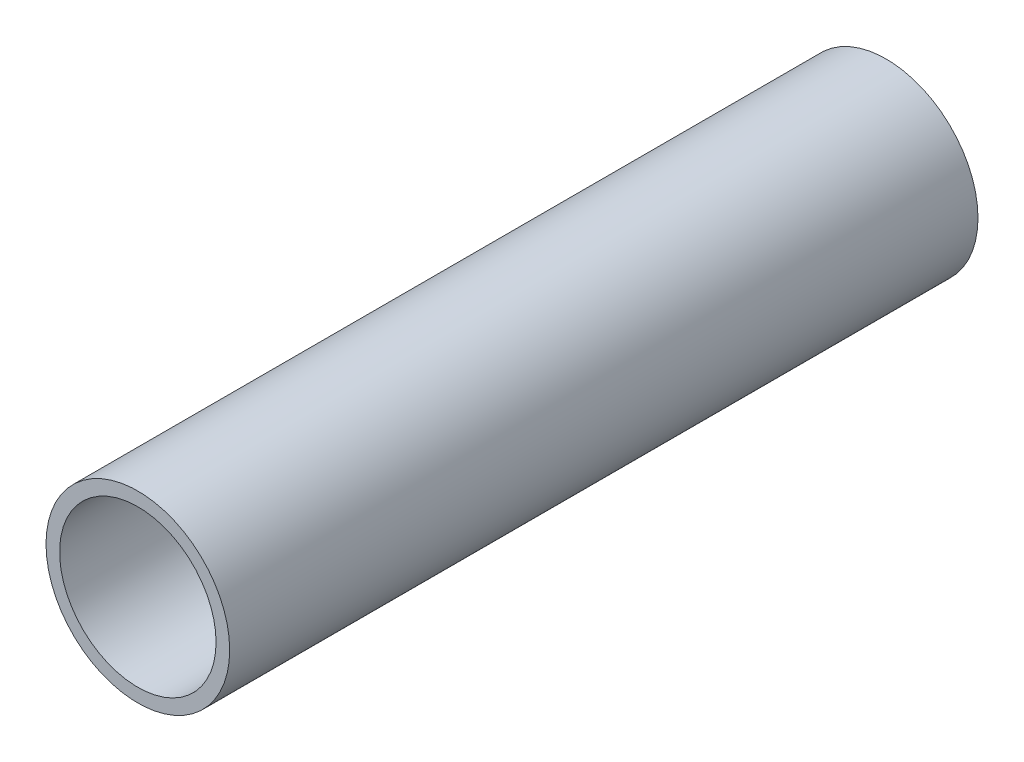
ISO-10303-21;
HEADER;
FILE_DESCRIPTION(('STEP AP214'),'2;1');
FILE_NAME('part.step','',(''),(''),'','','');
FILE_SCHEMA(('AUTOMOTIVE_DESIGN { 1 0 10303 214 1 1 1 1 }'));
ENDSEC;
DATA;
#1=APPLICATION_CONTEXT('core data for automotive mechanical design processes');
#2=APPLICATION_PROTOCOL_DEFINITION('international standard','automotive_design',2000,#1);
#3=PRODUCT_CONTEXT('',#1,'mechanical');
#4=PRODUCT('Part','Part','',(#3));
#5=PRODUCT_RELATED_PRODUCT_CATEGORY('part','',(#4));
#6=PRODUCT_DEFINITION_FORMATION('','',#4);
#7=PRODUCT_DEFINITION_CONTEXT('part definition',#1,'design');
#8=PRODUCT_DEFINITION('design','',#6,#7);
#9=PRODUCT_DEFINITION_SHAPE('','',#8);
#10=(LENGTH_UNIT() NAMED_UNIT(*) SI_UNIT(.MILLI.,.METRE.));
#11=(NAMED_UNIT(*) PLANE_ANGLE_UNIT() SI_UNIT($,.RADIAN.));
#12=(NAMED_UNIT(*) SI_UNIT($,.STERADIAN.) SOLID_ANGLE_UNIT());
#13=UNCERTAINTY_MEASURE_WITH_UNIT(LENGTH_MEASURE(1.E-05),#10,'distance_accuracy_value','');
#14=(GEOMETRIC_REPRESENTATION_CONTEXT(3) GLOBAL_UNCERTAINTY_ASSIGNED_CONTEXT((#13)) GLOBAL_UNIT_ASSIGNED_CONTEXT((#10,
#11,#12)) REPRESENTATION_CONTEXT('',''));
#15=CARTESIAN_POINT('',(0.,0.,0.));
#16=DIRECTION('',(0.,0.,1.));
#17=DIRECTION('',(1.,0.,0.));
#18=AXIS2_PLACEMENT_3D('',#15,#16,#17);
#19=CARTESIAN_POINT('',(0.,0.,110.));
#20=DIRECTION('',(0.,0.,-1.));
#21=DIRECTION('',(-1.,0.,0.));
#22=AXIS2_PLACEMENT_3D('',#19,#20,#21);
#23=CYLINDRICAL_SURFACE('',#22,13.5);
#24=CARTESIAN_POINT('',(0.,0.,110.));
#25=DIRECTION('',(0.,0.,1.));
#26=DIRECTION('',(1.,0.,0.));
#27=AXIS2_PLACEMENT_3D('',#24,#25,#26);
#28=CIRCLE('',#27,13.5);
#29=CARTESIAN_POINT('',(13.5,0.,110.));
#30=VERTEX_POINT('',#29);
#31=EDGE_CURVE('E11',#30,#30,#28,.T.);
#32=ORIENTED_EDGE('',*,*,#31,.F.);
#33=EDGE_LOOP('',(#32));
#34=FACE_BOUND('',#33,.T.);
#35=CARTESIAN_POINT('',(0.,0.,0.));
#36=DIRECTION('',(0.,0.,1.));
#37=DIRECTION('',(1.,0.,0.));
#38=AXIS2_PLACEMENT_3D('',#35,#36,#37);
#39=CIRCLE('',#38,13.5);
#40=CARTESIAN_POINT('',(13.5,0.,0.));
#41=VERTEX_POINT('',#40);
#42=EDGE_CURVE('E49',#41,#41,#39,.T.);
#43=ORIENTED_EDGE('',*,*,#42,.T.);
#44=EDGE_LOOP('',(#43));
#45=FACE_BOUND('',#44,.T.);
#46=ADVANCED_FACE('F50',(#34,#45),#23,.T.);
#47=CARTESIAN_POINT('',(0.,0.,110.));
#48=DIRECTION('',(0.,0.,1.));
#49=DIRECTION('',(1.,0.,0.));
#50=AXIS2_PLACEMENT_3D('',#47,#48,#49);
#51=PLANE('',#50);
#52=CARTESIAN_POINT('',(0.,0.,110.));
#53=DIRECTION('',(0.,0.,1.));
#54=DIRECTION('',(1.,0.,0.));
#55=AXIS2_PLACEMENT_3D('',#52,#53,#54);
#56=CIRCLE('',#55,11.5);
#57=CARTESIAN_POINT('',(11.5,0.,110.));
#58=VERTEX_POINT('',#57);
#59=EDGE_CURVE('E63',#58,#58,#56,.T.);
#60=ORIENTED_EDGE('',*,*,#59,.F.);
#61=EDGE_LOOP('',(#60));
#62=FACE_BOUND('',#61,.T.);
#63=ORIENTED_EDGE('',*,*,#31,.T.);
#64=EDGE_LOOP('',(#63));
#65=FACE_BOUND('',#64,.T.);
#66=ADVANCED_FACE('F79',(#62,#65),#51,.T.);
#67=CARTESIAN_POINT('',(0.,0.,0.));
#68=DIRECTION('',(0.,0.,1.));
#69=DIRECTION('',(1.,0.,0.));
#70=AXIS2_PLACEMENT_3D('',#67,#68,#69);
#71=PLANE('',#70);
#72=CARTESIAN_POINT('',(0.,0.,0.));
#73=DIRECTION('',(0.,0.,1.));
#74=DIRECTION('',(1.,0.,0.));
#75=AXIS2_PLACEMENT_3D('',#72,#73,#74);
#76=CIRCLE('',#75,11.5);
#77=CARTESIAN_POINT('',(11.5,0.,0.));
#78=VERTEX_POINT('',#77);
#79=EDGE_CURVE('E58',#78,#78,#76,.T.);
#80=ORIENTED_EDGE('',*,*,#79,.T.);
#81=EDGE_LOOP('',(#80));
#82=FACE_BOUND('',#81,.T.);
#83=ORIENTED_EDGE('',*,*,#42,.F.);
#84=EDGE_LOOP('',(#83));
#85=FACE_BOUND('',#84,.T.);
#86=ADVANCED_FACE('F70',(#82,#85),#71,.F.);
#87=CARTESIAN_POINT('',(0.,0.,0.));
#88=DIRECTION('',(0.,0.,1.));
#89=DIRECTION('',(1.,0.,0.));
#90=AXIS2_PLACEMENT_3D('',#87,#88,#89);
#91=CYLINDRICAL_SURFACE('',#90,11.5);
#92=ORIENTED_EDGE('',*,*,#79,.F.);
#93=EDGE_LOOP('',(#92));
#94=FACE_BOUND('',#93,.T.);
#95=ORIENTED_EDGE('',*,*,#59,.T.);
#96=EDGE_LOOP('',(#95));
#97=FACE_BOUND('',#96,.T.);
#98=ADVANCED_FACE('F72',(#94,#97),#91,.F.);
#99=CLOSED_SHELL('',(#46,#66,#86,#98));
#100=MANIFOLD_SOLID_BREP('B2',#99);
#101=ADVANCED_BREP_SHAPE_REPRESENTATION('',(#18,#100),#14);
#102=SHAPE_DEFINITION_REPRESENTATION(#9,#101);
ENDSEC;
END-ISO-10303-21;
